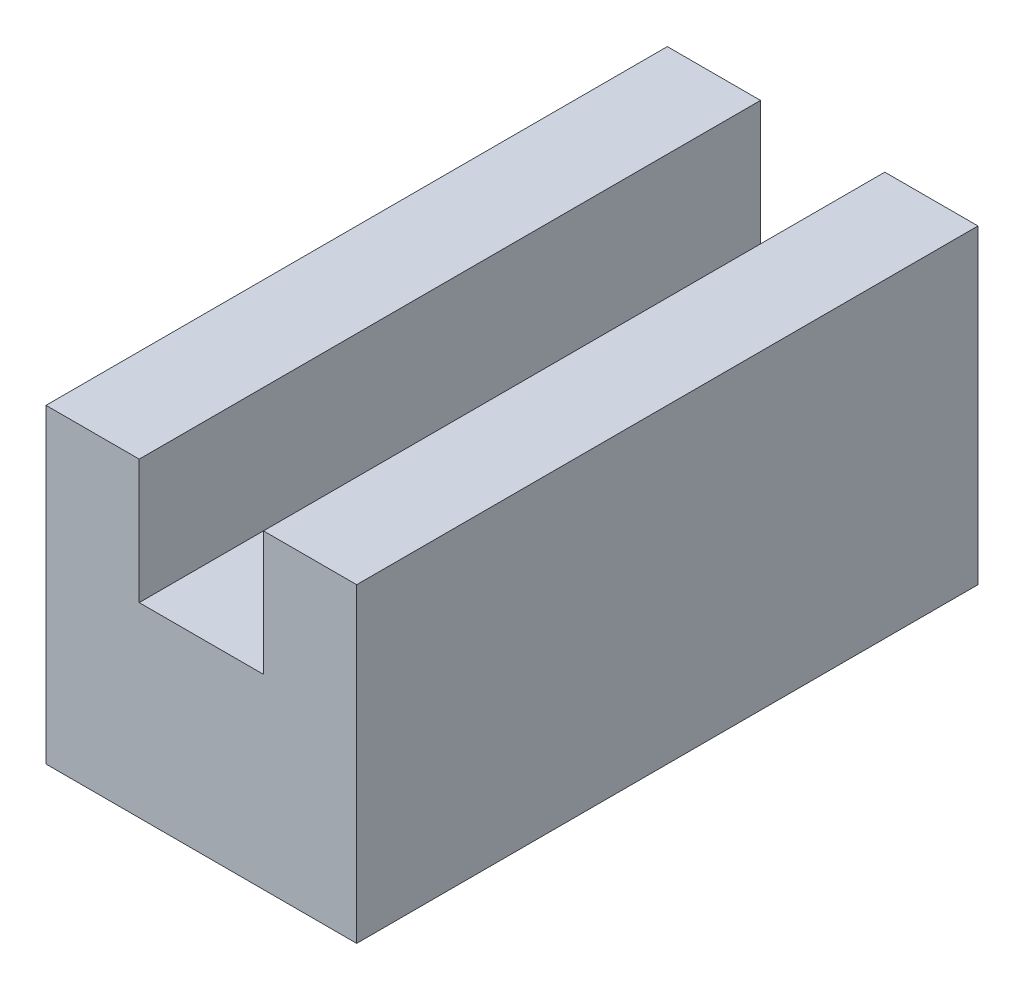
ISO-10303-21;
HEADER;
FILE_DESCRIPTION(('STEP AP214'),'2;1');
FILE_NAME('part.step','',(''),(''),'','','');
FILE_SCHEMA(('AUTOMOTIVE_DESIGN { 1 0 10303 214 1 1 1 1 }'));
ENDSEC;
DATA;
#1=APPLICATION_CONTEXT('core data for automotive mechanical design processes');
#2=APPLICATION_PROTOCOL_DEFINITION('international standard','automotive_design',2000,#1);
#3=PRODUCT_CONTEXT('',#1,'mechanical');
#4=PRODUCT('Part','Part','',(#3));
#5=PRODUCT_RELATED_PRODUCT_CATEGORY('part','',(#4));
#6=PRODUCT_DEFINITION_FORMATION('','',#4);
#7=PRODUCT_DEFINITION_CONTEXT('part definition',#1,'design');
#8=PRODUCT_DEFINITION('design','',#6,#7);
#9=PRODUCT_DEFINITION_SHAPE('','',#8);
#10=(LENGTH_UNIT() NAMED_UNIT(*) SI_UNIT(.MILLI.,.METRE.));
#11=(NAMED_UNIT(*) PLANE_ANGLE_UNIT() SI_UNIT($,.RADIAN.));
#12=(NAMED_UNIT(*) SI_UNIT($,.STERADIAN.) SOLID_ANGLE_UNIT());
#13=UNCERTAINTY_MEASURE_WITH_UNIT(LENGTH_MEASURE(1.E-05),#10,'distance_accuracy_value','');
#14=(GEOMETRIC_REPRESENTATION_CONTEXT(3) GLOBAL_UNCERTAINTY_ASSIGNED_CONTEXT((#13)) GLOBAL_UNIT_ASSIGNED_CONTEXT((#10,
#11,#12)) REPRESENTATION_CONTEXT('',''));
#15=CARTESIAN_POINT('',(0.,0.,0.));
#16=DIRECTION('',(0.,0.,1.));
#17=DIRECTION('',(1.,0.,0.));
#18=AXIS2_PLACEMENT_3D('',#15,#16,#17);
#19=CARTESIAN_POINT('',(0.,5.,10.));
#20=DIRECTION('',(0.,-1.,0.));
#21=DIRECTION('',(0.,0.,-1.));
#22=AXIS2_PLACEMENT_3D('',#19,#20,#21);
#23=PLANE('',#22);
#24=DIRECTION('',(-1.,0.,0.));
#25=VECTOR('',#24,1.);
#26=CARTESIAN_POINT('',(0.,5.,10.));
#27=LINE('',#26,#25);
#28=CARTESIAN_POINT('',(1.5,5.,10.));
#29=VERTEX_POINT('',#28);
#30=CARTESIAN_POINT('',(0.,5.,10.));
#31=VERTEX_POINT('',#30);
#32=EDGE_CURVE('E56',#29,#31,#27,.T.);
#33=ORIENTED_EDGE('',*,*,#32,.F.);
#34=DIRECTION('',(0.,0.,1.));
#35=VECTOR('',#34,1.);
#36=CARTESIAN_POINT('',(1.5,5.,0.));
#37=LINE('',#36,#35);
#38=CARTESIAN_POINT('',(1.5,5.,0.));
#39=VERTEX_POINT('',#38);
#40=EDGE_CURVE('E110',#39,#29,#37,.T.);
#41=ORIENTED_EDGE('',*,*,#40,.F.);
#42=DIRECTION('',(-1.,0.,0.));
#43=VECTOR('',#42,1.);
#44=CARTESIAN_POINT('',(0.,5.,0.));
#45=LINE('',#44,#43);
#46=CARTESIAN_POINT('',(0.,5.,0.));
#47=VERTEX_POINT('',#46);
#48=EDGE_CURVE('E78',#39,#47,#45,.T.);
#49=ORIENTED_EDGE('',*,*,#48,.T.);
#50=DIRECTION('',(0.,0.,-1.));
#51=VECTOR('',#50,1.);
#52=CARTESIAN_POINT('',(0.,5.,10.));
#53=LINE('',#52,#51);
#54=EDGE_CURVE('E145',#31,#47,#53,.T.);
#55=ORIENTED_EDGE('',*,*,#54,.F.);
#56=EDGE_LOOP('',(#33,#41,#49,#55));
#57=FACE_BOUND('',#56,.T.);
#58=ADVANCED_FACE('F32',(#57),#23,.F.);
#59=CARTESIAN_POINT('',(0.,0.,10.));
#60=DIRECTION('',(1.,0.,0.));
#61=DIRECTION('',(0.,0.,-1.));
#62=AXIS2_PLACEMENT_3D('',#59,#60,#61);
#63=PLANE('',#62);
#64=DIRECTION('',(0.,-1.,0.));
#65=VECTOR('',#64,1.);
#66=CARTESIAN_POINT('',(0.,0.,0.));
#67=LINE('',#66,#65);
#68=CARTESIAN_POINT('',(0.,0.,0.));
#69=VERTEX_POINT('',#68);
#70=EDGE_CURVE('E132',#47,#69,#67,.T.);
#71=ORIENTED_EDGE('',*,*,#70,.T.);
#72=DIRECTION('',(0.,0.,-1.));
#73=VECTOR('',#72,1.);
#74=CARTESIAN_POINT('',(0.,0.,10.));
#75=LINE('',#74,#73);
#76=CARTESIAN_POINT('',(0.,0.,10.));
#77=VERTEX_POINT('',#76);
#78=EDGE_CURVE('E11',#77,#69,#75,.T.);
#79=ORIENTED_EDGE('',*,*,#78,.F.);
#80=DIRECTION('',(0.,-1.,0.));
#81=VECTOR('',#80,1.);
#82=CARTESIAN_POINT('',(0.,0.,10.));
#83=LINE('',#82,#81);
#84=EDGE_CURVE('E137',#31,#77,#83,.T.);
#85=ORIENTED_EDGE('',*,*,#84,.F.);
#86=ORIENTED_EDGE('',*,*,#54,.T.);
#87=EDGE_LOOP('',(#71,#79,#85,#86));
#88=FACE_BOUND('',#87,.T.);
#89=ADVANCED_FACE('F34',(#88),#63,.F.);
#90=CARTESIAN_POINT('',(0.,0.,10.));
#91=DIRECTION('',(0.,1.,0.));
#92=DIRECTION('',(0.,0.,1.));
#93=AXIS2_PLACEMENT_3D('',#90,#91,#92);
#94=PLANE('',#93);
#95=DIRECTION('',(1.,0.,0.));
#96=VECTOR('',#95,1.);
#97=CARTESIAN_POINT('',(0.,0.,0.));
#98=LINE('',#97,#96);
#99=CARTESIAN_POINT('',(5.,0.,0.));
#100=VERTEX_POINT('',#99);
#101=EDGE_CURVE('E148',#69,#100,#98,.T.);
#102=ORIENTED_EDGE('',*,*,#101,.T.);
#103=DIRECTION('',(0.,0.,-1.));
#104=VECTOR('',#103,1.);
#105=CARTESIAN_POINT('',(5.,0.,10.));
#106=LINE('',#105,#104);
#107=CARTESIAN_POINT('',(5.,0.,10.));
#108=VERTEX_POINT('',#107);
#109=EDGE_CURVE('E40',#108,#100,#106,.T.);
#110=ORIENTED_EDGE('',*,*,#109,.F.);
#111=DIRECTION('',(1.,0.,0.));
#112=VECTOR('',#111,1.);
#113=CARTESIAN_POINT('',(0.,0.,10.));
#114=LINE('',#113,#112);
#115=EDGE_CURVE('E85',#77,#108,#114,.T.);
#116=ORIENTED_EDGE('',*,*,#115,.F.);
#117=ORIENTED_EDGE('',*,*,#78,.T.);
#118=EDGE_LOOP('',(#102,#110,#116,#117));
#119=FACE_BOUND('',#118,.T.);
#120=ADVANCED_FACE('F174',(#119),#94,.F.);
#121=CARTESIAN_POINT('',(5.,0.,10.));
#122=DIRECTION('',(-1.,0.,0.));
#123=DIRECTION('',(0.,0.,1.));
#124=AXIS2_PLACEMENT_3D('',#121,#122,#123);
#125=PLANE('',#124);
#126=DIRECTION('',(0.,1.,0.));
#127=VECTOR('',#126,1.);
#128=CARTESIAN_POINT('',(5.,0.,0.));
#129=LINE('',#128,#127);
#130=CARTESIAN_POINT('',(5.,5.,0.));
#131=VERTEX_POINT('',#130);
#132=EDGE_CURVE('E150',#100,#131,#129,.T.);
#133=ORIENTED_EDGE('',*,*,#132,.T.);
#134=DIRECTION('',(0.,0.,-1.));
#135=VECTOR('',#134,1.);
#136=CARTESIAN_POINT('',(5.,5.,10.));
#137=LINE('',#136,#135);
#138=CARTESIAN_POINT('',(5.,5.,10.));
#139=VERTEX_POINT('',#138);
#140=EDGE_CURVE('E155',#139,#131,#137,.T.);
#141=ORIENTED_EDGE('',*,*,#140,.F.);
#142=DIRECTION('',(0.,1.,0.));
#143=VECTOR('',#142,1.);
#144=CARTESIAN_POINT('',(5.,0.,10.));
#145=LINE('',#144,#143);
#146=EDGE_CURVE('E141',#108,#139,#145,.T.);
#147=ORIENTED_EDGE('',*,*,#146,.F.);
#148=ORIENTED_EDGE('',*,*,#109,.T.);
#149=EDGE_LOOP('',(#133,#141,#147,#148));
#150=FACE_BOUND('',#149,.T.);
#151=ADVANCED_FACE('F161',(#150),#125,.F.);
#152=CARTESIAN_POINT('',(3.5,5.,0.));
#153=VERTEX_POINT('',#152);
#154=EDGE_CURVE('E139',#131,#153,#45,.T.);
#155=ORIENTED_EDGE('',*,*,#154,.T.);
#156=DIRECTION('',(0.,0.,-1.));
#157=VECTOR('',#156,1.);
#158=CARTESIAN_POINT('',(3.5,5.,0.));
#159=LINE('',#158,#157);
#160=CARTESIAN_POINT('',(3.5,5.,10.));
#161=VERTEX_POINT('',#160);
#162=EDGE_CURVE('E120',#161,#153,#159,.T.);
#163=ORIENTED_EDGE('',*,*,#162,.F.);
#164=EDGE_CURVE('E143',#139,#161,#27,.T.);
#165=ORIENTED_EDGE('',*,*,#164,.F.);
#166=ORIENTED_EDGE('',*,*,#140,.T.);
#167=EDGE_LOOP('',(#155,#163,#165,#166));
#168=FACE_BOUND('',#167,.T.);
#169=ADVANCED_FACE('F169',(#168),#23,.F.);
#170=CARTESIAN_POINT('',(0.,0.,10.));
#171=DIRECTION('',(0.,0.,-1.));
#172=DIRECTION('',(-1.,0.,0.));
#173=AXIS2_PLACEMENT_3D('',#170,#171,#172);
#174=PLANE('',#173);
#175=DIRECTION('',(1.,0.,0.));
#176=VECTOR('',#175,1.);
#177=CARTESIAN_POINT('',(1.5,3.,10.));
#178=LINE('',#177,#176);
#179=CARTESIAN_POINT('',(1.5,3.,10.));
#180=VERTEX_POINT('',#179);
#181=CARTESIAN_POINT('',(3.5,3.,10.));
#182=VERTEX_POINT('',#181);
#183=EDGE_CURVE('E116',#180,#182,#178,.T.);
#184=ORIENTED_EDGE('',*,*,#183,.F.);
#185=DIRECTION('',(0.,1.,0.));
#186=VECTOR('',#185,1.);
#187=CARTESIAN_POINT('',(1.5,3.,10.));
#188=LINE('',#187,#186);
#189=EDGE_CURVE('E106',#180,#29,#188,.T.);
#190=ORIENTED_EDGE('',*,*,#189,.T.);
#191=ORIENTED_EDGE('',*,*,#32,.T.);
#192=ORIENTED_EDGE('',*,*,#84,.T.);
#193=ORIENTED_EDGE('',*,*,#115,.T.);
#194=ORIENTED_EDGE('',*,*,#146,.T.);
#195=ORIENTED_EDGE('',*,*,#164,.T.);
#196=DIRECTION('',(0.,1.,0.));
#197=VECTOR('',#196,1.);
#198=CARTESIAN_POINT('',(3.5,3.,10.));
#199=LINE('',#198,#197);
#200=EDGE_CURVE('E112',#182,#161,#199,.T.);
#201=ORIENTED_EDGE('',*,*,#200,.F.);
#202=EDGE_LOOP('',(#184,#190,#191,#192,#193,#194,#195,#201));
#203=FACE_BOUND('',#202,.T.);
#204=ADVANCED_FACE('F122',(#203),#174,.F.);
#205=CARTESIAN_POINT('',(0.,0.,0.));
#206=DIRECTION('',(0.,0.,-1.));
#207=DIRECTION('',(-1.,0.,0.));
#208=AXIS2_PLACEMENT_3D('',#205,#206,#207);
#209=PLANE('',#208);
#210=DIRECTION('',(0.,1.,0.));
#211=VECTOR('',#210,1.);
#212=CARTESIAN_POINT('',(1.5,3.,0.));
#213=LINE('',#212,#211);
#214=CARTESIAN_POINT('',(1.5,3.,0.));
#215=VERTEX_POINT('',#214);
#216=EDGE_CURVE('E130',#215,#39,#213,.T.);
#217=ORIENTED_EDGE('',*,*,#216,.F.);
#218=DIRECTION('',(-1.,0.,0.));
#219=VECTOR('',#218,1.);
#220=CARTESIAN_POINT('',(1.5,3.,0.));
#221=LINE('',#220,#219);
#222=CARTESIAN_POINT('',(3.5,3.,0.));
#223=VERTEX_POINT('',#222);
#224=EDGE_CURVE('E113',#223,#215,#221,.T.);
#225=ORIENTED_EDGE('',*,*,#224,.F.);
#226=DIRECTION('',(0.,1.,0.));
#227=VECTOR('',#226,1.);
#228=CARTESIAN_POINT('',(3.5,3.,0.));
#229=LINE('',#228,#227);
#230=EDGE_CURVE('E133',#223,#153,#229,.T.);
#231=ORIENTED_EDGE('',*,*,#230,.T.);
#232=ORIENTED_EDGE('',*,*,#154,.F.);
#233=ORIENTED_EDGE('',*,*,#132,.F.);
#234=ORIENTED_EDGE('',*,*,#101,.F.);
#235=ORIENTED_EDGE('',*,*,#70,.F.);
#236=ORIENTED_EDGE('',*,*,#48,.F.);
#237=EDGE_LOOP('',(#217,#225,#231,#232,#233,#234,#235,#236));
#238=FACE_BOUND('',#237,.T.);
#239=ADVANCED_FACE('F165',(#238),#209,.T.);
#240=CARTESIAN_POINT('',(1.5,3.,0.));
#241=DIRECTION('',(-1.,0.,0.));
#242=DIRECTION('',(0.,0.,1.));
#243=AXIS2_PLACEMENT_3D('',#240,#241,#242);
#244=PLANE('',#243);
#245=ORIENTED_EDGE('',*,*,#40,.T.);
#246=ORIENTED_EDGE('',*,*,#189,.F.);
#247=DIRECTION('',(0.,0.,1.));
#248=VECTOR('',#247,1.);
#249=CARTESIAN_POINT('',(1.5,3.,0.));
#250=LINE('',#249,#248);
#251=EDGE_CURVE('E109',#215,#180,#250,.T.);
#252=ORIENTED_EDGE('',*,*,#251,.F.);
#253=ORIENTED_EDGE('',*,*,#216,.T.);
#254=EDGE_LOOP('',(#245,#246,#252,#253));
#255=FACE_BOUND('',#254,.T.);
#256=ADVANCED_FACE('F108',(#255),#244,.F.);
#257=CARTESIAN_POINT('',(3.5,3.,0.));
#258=DIRECTION('',(1.,0.,0.));
#259=DIRECTION('',(0.,0.,-1.));
#260=AXIS2_PLACEMENT_3D('',#257,#258,#259);
#261=PLANE('',#260);
#262=ORIENTED_EDGE('',*,*,#162,.T.);
#263=ORIENTED_EDGE('',*,*,#230,.F.);
#264=DIRECTION('',(0.,0.,-1.));
#265=VECTOR('',#264,1.);
#266=CARTESIAN_POINT('',(3.5,3.,0.));
#267=LINE('',#266,#265);
#268=EDGE_CURVE('E47',#182,#223,#267,.T.);
#269=ORIENTED_EDGE('',*,*,#268,.F.);
#270=ORIENTED_EDGE('',*,*,#200,.T.);
#271=EDGE_LOOP('',(#262,#263,#269,#270));
#272=FACE_BOUND('',#271,.T.);
#273=ADVANCED_FACE('F197',(#272),#261,.F.);
#274=CARTESIAN_POINT('',(0.,3.,0.));
#275=DIRECTION('',(0.,1.,0.));
#276=DIRECTION('',(0.,0.,1.));
#277=AXIS2_PLACEMENT_3D('',#274,#275,#276);
#278=PLANE('',#277);
#279=ORIENTED_EDGE('',*,*,#251,.T.);
#280=ORIENTED_EDGE('',*,*,#183,.T.);
#281=ORIENTED_EDGE('',*,*,#268,.T.);
#282=ORIENTED_EDGE('',*,*,#224,.T.);
#283=EDGE_LOOP('',(#279,#280,#281,#282));
#284=FACE_BOUND('',#283,.T.);
#285=ADVANCED_FACE('F115',(#284),#278,.T.);
#286=CLOSED_SHELL('',(#58,#89,#120,#151,#169,#204,#239,#256,#273,#285));
#287=MANIFOLD_SOLID_BREP('B2',#286);
#288=ADVANCED_BREP_SHAPE_REPRESENTATION('',(#18,#287),#14);
#289=SHAPE_DEFINITION_REPRESENTATION(#9,#288);
ENDSEC;
END-ISO-10303-21;
